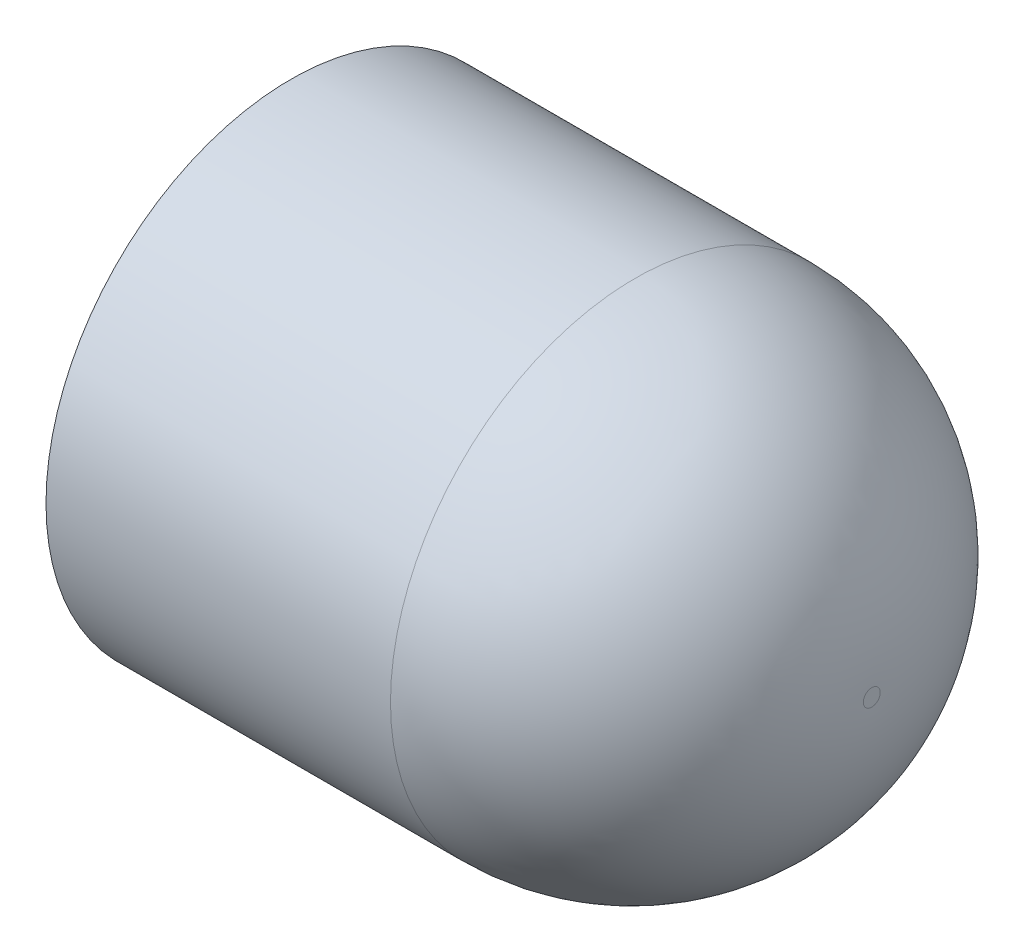
ISO-10303-21;
HEADER;
FILE_DESCRIPTION(('STEP AP214'),'2;1');
FILE_NAME('part.step','',(''),(''),'','','');
FILE_SCHEMA(('AUTOMOTIVE_DESIGN { 1 0 10303 214 1 1 1 1 }'));
ENDSEC;
DATA;
#1=APPLICATION_CONTEXT('core data for automotive mechanical design processes');
#2=APPLICATION_PROTOCOL_DEFINITION('international standard','automotive_design',2000,#1);
#3=PRODUCT_CONTEXT('',#1,'mechanical');
#4=PRODUCT('Part','Part','',(#3));
#5=PRODUCT_RELATED_PRODUCT_CATEGORY('part','',(#4));
#6=PRODUCT_DEFINITION_FORMATION('','',#4);
#7=PRODUCT_DEFINITION_CONTEXT('part definition',#1,'design');
#8=PRODUCT_DEFINITION('design','',#6,#7);
#9=PRODUCT_DEFINITION_SHAPE('','',#8);
#10=(LENGTH_UNIT() NAMED_UNIT(*) SI_UNIT(.MILLI.,.METRE.));
#11=(NAMED_UNIT(*) PLANE_ANGLE_UNIT() SI_UNIT($,.RADIAN.));
#12=(NAMED_UNIT(*) SI_UNIT($,.STERADIAN.) SOLID_ANGLE_UNIT());
#13=UNCERTAINTY_MEASURE_WITH_UNIT(LENGTH_MEASURE(1.E-05),#10,'distance_accuracy_value','');
#14=(GEOMETRIC_REPRESENTATION_CONTEXT(3) GLOBAL_UNCERTAINTY_ASSIGNED_CONTEXT((#13)) GLOBAL_UNIT_ASSIGNED_CONTEXT((#10,
#11,#12)) REPRESENTATION_CONTEXT('',''));
#15=CARTESIAN_POINT('',(0.,0.,0.));
#16=DIRECTION('',(0.,0.,1.));
#17=DIRECTION('',(1.,0.,0.));
#18=AXIS2_PLACEMENT_3D('',#15,#16,#17);
#19=CARTESIAN_POINT('',(0.,0.,0.));
#20=DIRECTION('',(1.,0.,0.));
#21=DIRECTION('',(0.,0.,-1.));
#22=AXIS2_PLACEMENT_3D('',#19,#20,#21);
#23=PLANE('',#22);
#24=CARTESIAN_POINT('',(0.,0.,0.));
#25=DIRECTION('',(-1.,0.,0.));
#26=DIRECTION('',(0.,0.,1.));
#27=AXIS2_PLACEMENT_3D('',#24,#25,#26);
#28=CIRCLE('',#27,9.2075);
#29=CARTESIAN_POINT('',(0.,0.,9.2075));
#30=VERTEX_POINT('',#29);
#31=EDGE_CURVE('E10',#30,#30,#28,.T.);
#32=ORIENTED_EDGE('',*,*,#31,.T.);
#33=EDGE_LOOP('',(#32));
#34=FACE_BOUND('',#33,.T.);
#35=ADVANCED_FACE('F30',(#34),#23,.F.);
#36=CARTESIAN_POINT('',(0.,0.,0.));
#37=DIRECTION('',(-1.,0.,0.));
#38=DIRECTION('',(0.,0.,1.));
#39=AXIS2_PLACEMENT_3D('',#36,#37,#38);
#40=CYLINDRICAL_SURFACE('',#39,9.2075);
#41=ORIENTED_EDGE('',*,*,#31,.F.);
#42=EDGE_LOOP('',(#41));
#43=FACE_BOUND('',#42,.T.);
#44=CARTESIAN_POINT('',(12.954,0.,0.));
#45=DIRECTION('',(-1.,0.,0.));
#46=DIRECTION('',(0.,0.,1.));
#47=AXIS2_PLACEMENT_3D('',#44,#45,#46);
#48=CIRCLE('',#47,9.2075);
#49=CARTESIAN_POINT('',(12.954,0.,9.2075));
#50=VERTEX_POINT('',#49);
#51=EDGE_CURVE('E36',#50,#50,#48,.T.);
#52=ORIENTED_EDGE('',*,*,#51,.T.);
#53=EDGE_LOOP('',(#52));
#54=FACE_BOUND('',#53,.T.);
#55=ADVANCED_FACE('F55',(#43,#54),#40,.T.);
#56=CARTESIAN_POINT('',(12.954,0.,0.));
#57=DIRECTION('',(-1.,0.,0.));
#58=DIRECTION('',(0.,0.,1.));
#59=AXIS2_PLACEMENT_3D('',#56,#57,#58);
#60=DEGENERATE_TOROIDAL_SURFACE('',#59,0.3175,8.89,.T.);
#61=ORIENTED_EDGE('',*,*,#51,.F.);
#62=EDGE_LOOP('',(#61));
#63=FACE_BOUND('',#62,.T.);
#64=CARTESIAN_POINT('',(21.844,0.,0.));
#65=DIRECTION('',(-1.,0.,0.));
#66=DIRECTION('',(0.,0.,1.));
#67=AXIS2_PLACEMENT_3D('',#64,#65,#66);
#68=CIRCLE('',#67,0.3175);
#69=CARTESIAN_POINT('',(21.844,0.,0.3175));
#70=VERTEX_POINT('',#69);
#71=EDGE_CURVE('E40',#70,#70,#68,.T.);
#72=ORIENTED_EDGE('',*,*,#71,.T.);
#73=EDGE_LOOP('',(#72));
#74=FACE_BOUND('',#73,.T.);
#75=ADVANCED_FACE('F47',(#63,#74),#60,.T.);
#76=CARTESIAN_POINT('',(21.844,0.,0.));
#77=DIRECTION('',(-1.,0.,0.));
#78=DIRECTION('',(0.,0.,1.));
#79=AXIS2_PLACEMENT_3D('',#76,#77,#78);
#80=PLANE('',#79);
#81=ORIENTED_EDGE('',*,*,#71,.F.);
#82=EDGE_LOOP('',(#81));
#83=FACE_BOUND('',#82,.T.);
#84=ADVANCED_FACE('F49',(#83),#80,.F.);
#85=CLOSED_SHELL('',(#35,#55,#75,#84));
#86=MANIFOLD_SOLID_BREP('B2',#85);
#87=ADVANCED_BREP_SHAPE_REPRESENTATION('',(#18,#86),#14);
#88=SHAPE_DEFINITION_REPRESENTATION(#9,#87);
ENDSEC;
END-ISO-10303-21;
